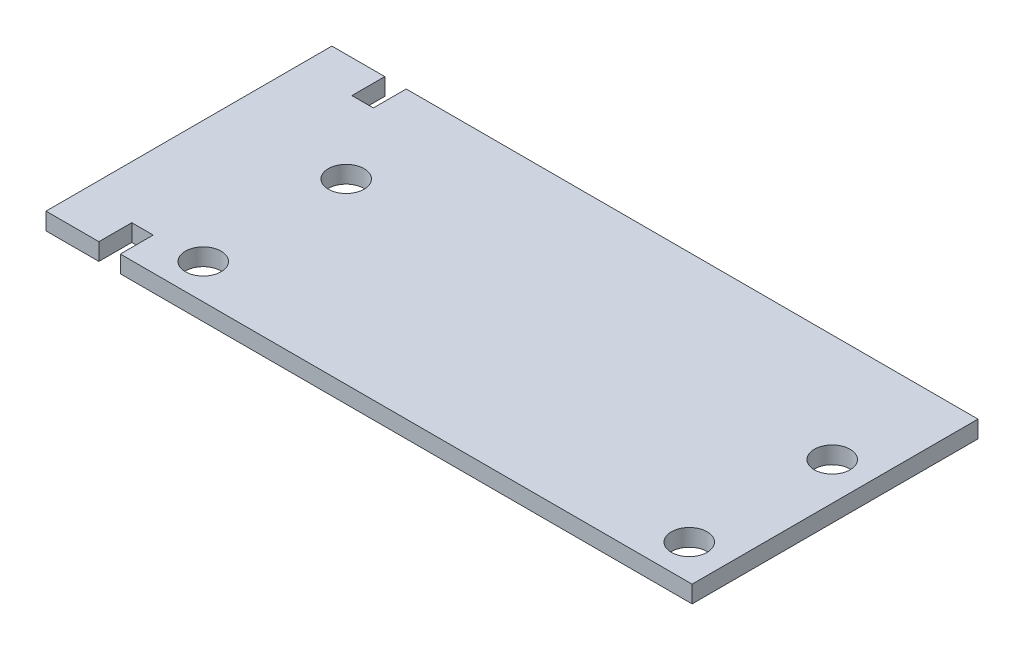
ISO-10303-21;
HEADER;
FILE_DESCRIPTION(('STEP AP214'),'2;1');
FILE_NAME('part.step','',(''),(''),'','','');
FILE_SCHEMA(('AUTOMOTIVE_DESIGN { 1 0 10303 214 1 1 1 1 }'));
ENDSEC;
DATA;
#1=APPLICATION_CONTEXT('core data for automotive mechanical design processes');
#2=APPLICATION_PROTOCOL_DEFINITION('international standard','automotive_design',2000,#1);
#3=PRODUCT_CONTEXT('',#1,'mechanical');
#4=PRODUCT('Part','Part','',(#3));
#5=PRODUCT_RELATED_PRODUCT_CATEGORY('part','',(#4));
#6=PRODUCT_DEFINITION_FORMATION('','',#4);
#7=PRODUCT_DEFINITION_CONTEXT('part definition',#1,'design');
#8=PRODUCT_DEFINITION('design','',#6,#7);
#9=PRODUCT_DEFINITION_SHAPE('','',#8);
#10=(LENGTH_UNIT() NAMED_UNIT(*) SI_UNIT(.MILLI.,.METRE.));
#11=(NAMED_UNIT(*) PLANE_ANGLE_UNIT() SI_UNIT($,.RADIAN.));
#12=(NAMED_UNIT(*) SI_UNIT($,.STERADIAN.) SOLID_ANGLE_UNIT());
#13=UNCERTAINTY_MEASURE_WITH_UNIT(LENGTH_MEASURE(1.E-05),#10,'distance_accuracy_value','');
#14=(GEOMETRIC_REPRESENTATION_CONTEXT(3) GLOBAL_UNCERTAINTY_ASSIGNED_CONTEXT((#13)) GLOBAL_UNIT_ASSIGNED_CONTEXT((#10,
#11,#12)) REPRESENTATION_CONTEXT('',''));
#15=CARTESIAN_POINT('',(0.,0.,0.));
#16=DIRECTION('',(0.,0.,1.));
#17=DIRECTION('',(1.,0.,0.));
#18=AXIS2_PLACEMENT_3D('',#15,#16,#17);
#19=CARTESIAN_POINT('',(0.,1.2,0.));
#20=DIRECTION('',(1.,0.,0.));
#21=DIRECTION('',(0.,0.,-1.));
#22=AXIS2_PLACEMENT_3D('',#19,#20,#21);
#23=PLANE('',#22);
#24=DIRECTION('',(0.,0.,1.));
#25=VECTOR('',#24,1.);
#26=CARTESIAN_POINT('',(0.,0.,0.));
#27=LINE('',#26,#25);
#28=CARTESIAN_POINT('',(0.,0.,-2.3));
#29=VERTEX_POINT('',#28);
#30=CARTESIAN_POINT('',(0.,0.,0.));
#31=VERTEX_POINT('',#30);
#32=EDGE_CURVE('E158',#29,#31,#27,.T.);
#33=ORIENTED_EDGE('',*,*,#32,.T.);
#34=DIRECTION('',(0.,-1.,0.));
#35=VECTOR('',#34,1.);
#36=CARTESIAN_POINT('',(0.,1.2,0.));
#37=LINE('',#36,#35);
#38=CARTESIAN_POINT('',(0.,1.2,0.));
#39=VERTEX_POINT('',#38);
#40=EDGE_CURVE('E11',#39,#31,#37,.T.);
#41=ORIENTED_EDGE('',*,*,#40,.F.);
#42=DIRECTION('',(0.,0.,1.));
#43=VECTOR('',#42,1.);
#44=CARTESIAN_POINT('',(0.,1.2,0.));
#45=LINE('',#44,#43);
#46=CARTESIAN_POINT('',(0.,1.2,-2.3));
#47=VERTEX_POINT('',#46);
#48=EDGE_CURVE('E181',#47,#39,#45,.T.);
#49=ORIENTED_EDGE('',*,*,#48,.F.);
#50=DIRECTION('',(0.,-1.,0.));
#51=VECTOR('',#50,1.);
#52=CARTESIAN_POINT('',(0.,1.2,-2.3));
#53=LINE('',#52,#51);
#54=EDGE_CURVE('E154',#47,#29,#53,.T.);
#55=ORIENTED_EDGE('',*,*,#54,.T.);
#56=EDGE_LOOP('',(#33,#41,#49,#55));
#57=FACE_BOUND('',#56,.T.);
#58=ADVANCED_FACE('F38',(#57),#23,.F.);
#59=CARTESIAN_POINT('',(0.,1.2,0.));
#60=DIRECTION('',(0.,0.,-1.));
#61=DIRECTION('',(-1.,0.,0.));
#62=AXIS2_PLACEMENT_3D('',#59,#60,#61);
#63=PLANE('',#62);
#64=DIRECTION('',(1.,0.,0.));
#65=VECTOR('',#64,1.);
#66=CARTESIAN_POINT('',(0.,0.,0.));
#67=LINE('',#66,#65);
#68=CARTESIAN_POINT('',(40.,0.,0.));
#69=VERTEX_POINT('',#68);
#70=EDGE_CURVE('E161',#31,#69,#67,.T.);
#71=ORIENTED_EDGE('',*,*,#70,.T.);
#72=DIRECTION('',(0.,-1.,0.));
#73=VECTOR('',#72,1.);
#74=CARTESIAN_POINT('',(40.,1.2,0.));
#75=LINE('',#74,#73);
#76=CARTESIAN_POINT('',(40.,1.2,0.));
#77=VERTEX_POINT('',#76);
#78=EDGE_CURVE('E46',#77,#69,#75,.T.);
#79=ORIENTED_EDGE('',*,*,#78,.F.);
#80=DIRECTION('',(1.,0.,0.));
#81=VECTOR('',#80,1.);
#82=CARTESIAN_POINT('',(0.,1.2,0.));
#83=LINE('',#82,#81);
#84=EDGE_CURVE('E109',#39,#77,#83,.T.);
#85=ORIENTED_EDGE('',*,*,#84,.F.);
#86=ORIENTED_EDGE('',*,*,#40,.T.);
#87=EDGE_LOOP('',(#71,#79,#85,#86));
#88=FACE_BOUND('',#87,.T.);
#89=ADVANCED_FACE('F260',(#88),#63,.F.);
#90=CARTESIAN_POINT('',(40.,1.2,0.));
#91=DIRECTION('',(-1.,0.,0.));
#92=DIRECTION('',(0.,0.,1.));
#93=AXIS2_PLACEMENT_3D('',#90,#91,#92);
#94=PLANE('',#93);
#95=DIRECTION('',(0.,0.,-1.));
#96=VECTOR('',#95,1.);
#97=CARTESIAN_POINT('',(40.,0.,0.));
#98=LINE('',#97,#96);
#99=CARTESIAN_POINT('',(40.,0.,-20.));
#100=VERTEX_POINT('',#99);
#101=EDGE_CURVE('E164',#69,#100,#98,.T.);
#102=ORIENTED_EDGE('',*,*,#101,.T.);
#103=DIRECTION('',(0.,-1.,0.));
#104=VECTOR('',#103,1.);
#105=CARTESIAN_POINT('',(40.,1.2,-20.));
#106=LINE('',#105,#104);
#107=CARTESIAN_POINT('',(40.,1.2,-20.));
#108=VERTEX_POINT('',#107);
#109=EDGE_CURVE('E200',#108,#100,#106,.T.);
#110=ORIENTED_EDGE('',*,*,#109,.F.);
#111=DIRECTION('',(0.,0.,-1.));
#112=VECTOR('',#111,1.);
#113=CARTESIAN_POINT('',(40.,1.2,0.));
#114=LINE('',#113,#112);
#115=EDGE_CURVE('E208',#77,#108,#114,.T.);
#116=ORIENTED_EDGE('',*,*,#115,.F.);
#117=ORIENTED_EDGE('',*,*,#78,.T.);
#118=EDGE_LOOP('',(#102,#110,#116,#117));
#119=FACE_BOUND('',#118,.T.);
#120=ADVANCED_FACE('F206',(#119),#94,.F.);
#121=CARTESIAN_POINT('',(0.,1.2,-20.));
#122=DIRECTION('',(0.,0.,1.));
#123=DIRECTION('',(1.,0.,0.));
#124=AXIS2_PLACEMENT_3D('',#121,#122,#123);
#125=PLANE('',#124);
#126=DIRECTION('',(-1.,0.,0.));
#127=VECTOR('',#126,1.);
#128=CARTESIAN_POINT('',(0.,0.,-20.));
#129=LINE('',#128,#127);
#130=CARTESIAN_POINT('',(0.,0.,-20.));
#131=VERTEX_POINT('',#130);
#132=EDGE_CURVE('E166',#100,#131,#129,.T.);
#133=ORIENTED_EDGE('',*,*,#132,.T.);
#134=DIRECTION('',(0.,-1.,0.));
#135=VECTOR('',#134,1.);
#136=CARTESIAN_POINT('',(0.,1.2,-20.));
#137=LINE('',#136,#135);
#138=CARTESIAN_POINT('',(0.,1.2,-20.));
#139=VERTEX_POINT('',#138);
#140=EDGE_CURVE('E197',#139,#131,#137,.T.);
#141=ORIENTED_EDGE('',*,*,#140,.F.);
#142=DIRECTION('',(-1.,0.,0.));
#143=VECTOR('',#142,1.);
#144=CARTESIAN_POINT('',(0.,1.2,-20.));
#145=LINE('',#144,#143);
#146=EDGE_CURVE('E226',#108,#139,#145,.T.);
#147=ORIENTED_EDGE('',*,*,#146,.F.);
#148=ORIENTED_EDGE('',*,*,#109,.T.);
#149=EDGE_LOOP('',(#133,#141,#147,#148));
#150=FACE_BOUND('',#149,.T.);
#151=ADVANCED_FACE('F217',(#150),#125,.F.);
#152=CARTESIAN_POINT('',(0.,1.2,-17.7));
#153=DIRECTION('',(1.,0.,0.));
#154=DIRECTION('',(0.,0.,-1.));
#155=AXIS2_PLACEMENT_3D('',#152,#153,#154);
#156=PLANE('',#155);
#157=DIRECTION('',(0.,0.,1.));
#158=VECTOR('',#157,1.);
#159=CARTESIAN_POINT('',(0.,0.,-17.7));
#160=LINE('',#159,#158);
#161=CARTESIAN_POINT('',(0.,0.,-17.7));
#162=VERTEX_POINT('',#161);
#163=EDGE_CURVE('E168',#131,#162,#160,.T.);
#164=ORIENTED_EDGE('',*,*,#163,.T.);
#165=DIRECTION('',(0.,-1.,0.));
#166=VECTOR('',#165,1.);
#167=CARTESIAN_POINT('',(0.,1.2,-17.7));
#168=LINE('',#167,#166);
#169=CARTESIAN_POINT('',(0.,1.2,-17.7));
#170=VERTEX_POINT('',#169);
#171=EDGE_CURVE('E194',#170,#162,#168,.T.);
#172=ORIENTED_EDGE('',*,*,#171,.F.);
#173=DIRECTION('',(0.,0.,1.));
#174=VECTOR('',#173,1.);
#175=CARTESIAN_POINT('',(0.,1.2,-17.7));
#176=LINE('',#175,#174);
#177=EDGE_CURVE('E223',#139,#170,#176,.T.);
#178=ORIENTED_EDGE('',*,*,#177,.F.);
#179=ORIENTED_EDGE('',*,*,#140,.T.);
#180=EDGE_LOOP('',(#164,#172,#178,#179));
#181=FACE_BOUND('',#180,.T.);
#182=ADVANCED_FACE('F221',(#181),#156,.F.);
#183=CARTESIAN_POINT('',(0.,1.2,-17.7));
#184=DIRECTION('',(0.,0.,1.));
#185=DIRECTION('',(1.,0.,0.));
#186=AXIS2_PLACEMENT_3D('',#183,#184,#185);
#187=PLANE('',#186);
#188=DIRECTION('',(-1.,0.,0.));
#189=VECTOR('',#188,1.);
#190=CARTESIAN_POINT('',(0.,0.,-17.7));
#191=LINE('',#190,#189);
#192=CARTESIAN_POINT('',(-1.5,0.,-17.7));
#193=VERTEX_POINT('',#192);
#194=EDGE_CURVE('E170',#162,#193,#191,.T.);
#195=ORIENTED_EDGE('',*,*,#194,.T.);
#196=DIRECTION('',(0.,-1.,0.));
#197=VECTOR('',#196,1.);
#198=CARTESIAN_POINT('',(-1.5,1.2,-17.7));
#199=LINE('',#198,#197);
#200=CARTESIAN_POINT('',(-1.5,1.2,-17.7));
#201=VERTEX_POINT('',#200);
#202=EDGE_CURVE('E191',#201,#193,#199,.T.);
#203=ORIENTED_EDGE('',*,*,#202,.F.);
#204=DIRECTION('',(-1.,0.,0.));
#205=VECTOR('',#204,1.);
#206=CARTESIAN_POINT('',(0.,1.2,-17.7));
#207=LINE('',#206,#205);
#208=EDGE_CURVE('E225',#170,#201,#207,.T.);
#209=ORIENTED_EDGE('',*,*,#208,.F.);
#210=ORIENTED_EDGE('',*,*,#171,.T.);
#211=EDGE_LOOP('',(#195,#203,#209,#210));
#212=FACE_BOUND('',#211,.T.);
#213=ADVANCED_FACE('F273',(#212),#187,.F.);
#214=CARTESIAN_POINT('',(-1.5,1.2,-17.7));
#215=DIRECTION('',(-1.,0.,0.));
#216=DIRECTION('',(0.,0.,1.));
#217=AXIS2_PLACEMENT_3D('',#214,#215,#216);
#218=PLANE('',#217);
#219=DIRECTION('',(0.,0.,-1.));
#220=VECTOR('',#219,1.);
#221=CARTESIAN_POINT('',(-1.5,0.,-17.7));
#222=LINE('',#221,#220);
#223=CARTESIAN_POINT('',(-1.5,0.,-20.));
#224=VERTEX_POINT('',#223);
#225=EDGE_CURVE('E172',#193,#224,#222,.T.);
#226=ORIENTED_EDGE('',*,*,#225,.T.);
#227=DIRECTION('',(0.,-1.,0.));
#228=VECTOR('',#227,1.);
#229=CARTESIAN_POINT('',(-1.5,1.2,-20.));
#230=LINE('',#229,#228);
#231=CARTESIAN_POINT('',(-1.5,1.2,-20.));
#232=VERTEX_POINT('',#231);
#233=EDGE_CURVE('E188',#232,#224,#230,.T.);
#234=ORIENTED_EDGE('',*,*,#233,.F.);
#235=DIRECTION('',(0.,0.,-1.));
#236=VECTOR('',#235,1.);
#237=CARTESIAN_POINT('',(-1.5,1.2,-17.7));
#238=LINE('',#237,#236);
#239=EDGE_CURVE('E228',#201,#232,#238,.T.);
#240=ORIENTED_EDGE('',*,*,#239,.F.);
#241=ORIENTED_EDGE('',*,*,#202,.T.);
#242=EDGE_LOOP('',(#226,#234,#240,#241));
#243=FACE_BOUND('',#242,.T.);
#244=ADVANCED_FACE('F276',(#243),#218,.F.);
#245=CARTESIAN_POINT('',(-1.5,1.2,-20.));
#246=DIRECTION('',(0.,0.,1.));
#247=DIRECTION('',(1.,0.,0.));
#248=AXIS2_PLACEMENT_3D('',#245,#246,#247);
#249=PLANE('',#248);
#250=DIRECTION('',(-1.,0.,0.));
#251=VECTOR('',#250,1.);
#252=CARTESIAN_POINT('',(-1.5,0.,-20.));
#253=LINE('',#252,#251);
#254=CARTESIAN_POINT('',(-5.2,0.,-20.));
#255=VERTEX_POINT('',#254);
#256=EDGE_CURVE('E174',#224,#255,#253,.T.);
#257=ORIENTED_EDGE('',*,*,#256,.T.);
#258=DIRECTION('',(0.,-1.,0.));
#259=VECTOR('',#258,1.);
#260=CARTESIAN_POINT('',(-5.2,1.2,-20.));
#261=LINE('',#260,#259);
#262=CARTESIAN_POINT('',(-5.2,1.2,-20.));
#263=VERTEX_POINT('',#262);
#264=EDGE_CURVE('E185',#263,#255,#261,.T.);
#265=ORIENTED_EDGE('',*,*,#264,.F.);
#266=DIRECTION('',(-1.,0.,0.));
#267=VECTOR('',#266,1.);
#268=CARTESIAN_POINT('',(-1.5,1.2,-20.));
#269=LINE('',#268,#267);
#270=EDGE_CURVE('E234',#232,#263,#269,.T.);
#271=ORIENTED_EDGE('',*,*,#270,.F.);
#272=ORIENTED_EDGE('',*,*,#233,.T.);
#273=EDGE_LOOP('',(#257,#265,#271,#272));
#274=FACE_BOUND('',#273,.T.);
#275=ADVANCED_FACE('F240',(#274),#249,.F.);
#276=CARTESIAN_POINT('',(-5.2,1.2,-20.));
#277=DIRECTION('',(1.,0.,0.));
#278=DIRECTION('',(0.,0.,-1.));
#279=AXIS2_PLACEMENT_3D('',#276,#277,#278);
#280=PLANE('',#279);
#281=DIRECTION('',(0.,0.,1.));
#282=VECTOR('',#281,1.);
#283=CARTESIAN_POINT('',(-5.2,0.,-20.));
#284=LINE('',#283,#282);
#285=CARTESIAN_POINT('',(-5.2,0.,0.));
#286=VERTEX_POINT('',#285);
#287=EDGE_CURVE('E176',#255,#286,#284,.T.);
#288=ORIENTED_EDGE('',*,*,#287,.T.);
#289=DIRECTION('',(0.,-1.,0.));
#290=VECTOR('',#289,1.);
#291=CARTESIAN_POINT('',(-5.2,1.2,0.));
#292=LINE('',#291,#290);
#293=CARTESIAN_POINT('',(-5.2,1.2,0.));
#294=VERTEX_POINT('',#293);
#295=EDGE_CURVE('E149',#294,#286,#292,.T.);
#296=ORIENTED_EDGE('',*,*,#295,.F.);
#297=DIRECTION('',(0.,0.,1.));
#298=VECTOR('',#297,1.);
#299=CARTESIAN_POINT('',(-5.2,1.2,-20.));
#300=LINE('',#299,#298);
#301=EDGE_CURVE('E140',#263,#294,#300,.T.);
#302=ORIENTED_EDGE('',*,*,#301,.F.);
#303=ORIENTED_EDGE('',*,*,#264,.T.);
#304=EDGE_LOOP('',(#288,#296,#302,#303));
#305=FACE_BOUND('',#304,.T.);
#306=ADVANCED_FACE('F244',(#305),#280,.F.);
#307=CARTESIAN_POINT('',(-5.2,1.2,0.));
#308=DIRECTION('',(0.,0.,-1.));
#309=DIRECTION('',(-1.,0.,0.));
#310=AXIS2_PLACEMENT_3D('',#307,#308,#309);
#311=PLANE('',#310);
#312=DIRECTION('',(1.,0.,0.));
#313=VECTOR('',#312,1.);
#314=CARTESIAN_POINT('',(-5.2,0.,0.));
#315=LINE('',#314,#313);
#316=CARTESIAN_POINT('',(-1.5,0.,0.));
#317=VERTEX_POINT('',#316);
#318=EDGE_CURVE('E148',#286,#317,#315,.T.);
#319=ORIENTED_EDGE('',*,*,#318,.T.);
#320=DIRECTION('',(0.,-1.,0.));
#321=VECTOR('',#320,1.);
#322=CARTESIAN_POINT('',(-1.5,1.2,0.));
#323=LINE('',#322,#321);
#324=CARTESIAN_POINT('',(-1.5,1.2,0.));
#325=VERTEX_POINT('',#324);
#326=EDGE_CURVE('E145',#325,#317,#323,.T.);
#327=ORIENTED_EDGE('',*,*,#326,.F.);
#328=DIRECTION('',(1.,0.,0.));
#329=VECTOR('',#328,1.);
#330=CARTESIAN_POINT('',(-5.2,1.2,0.));
#331=LINE('',#330,#329);
#332=EDGE_CURVE('E134',#294,#325,#331,.T.);
#333=ORIENTED_EDGE('',*,*,#332,.F.);
#334=ORIENTED_EDGE('',*,*,#295,.T.);
#335=EDGE_LOOP('',(#319,#327,#333,#334));
#336=FACE_BOUND('',#335,.T.);
#337=ADVANCED_FACE('F146',(#336),#311,.F.);
#338=CARTESIAN_POINT('',(-1.5,1.2,0.));
#339=DIRECTION('',(-1.,0.,0.));
#340=DIRECTION('',(0.,0.,1.));
#341=AXIS2_PLACEMENT_3D('',#338,#339,#340);
#342=PLANE('',#341);
#343=DIRECTION('',(0.,0.,-1.));
#344=VECTOR('',#343,1.);
#345=CARTESIAN_POINT('',(-1.5,0.,0.));
#346=LINE('',#345,#344);
#347=CARTESIAN_POINT('',(-1.5,0.,-2.3));
#348=VERTEX_POINT('',#347);
#349=EDGE_CURVE('E95',#317,#348,#346,.T.);
#350=ORIENTED_EDGE('',*,*,#349,.T.);
#351=DIRECTION('',(0.,-1.,0.));
#352=VECTOR('',#351,1.);
#353=CARTESIAN_POINT('',(-1.5,1.2,-2.3));
#354=LINE('',#353,#352);
#355=CARTESIAN_POINT('',(-1.5,1.2,-2.3));
#356=VERTEX_POINT('',#355);
#357=EDGE_CURVE('E150',#356,#348,#354,.T.);
#358=ORIENTED_EDGE('',*,*,#357,.F.);
#359=DIRECTION('',(0.,0.,-1.));
#360=VECTOR('',#359,1.);
#361=CARTESIAN_POINT('',(-1.5,1.2,0.));
#362=LINE('',#361,#360);
#363=EDGE_CURVE('E138',#325,#356,#362,.T.);
#364=ORIENTED_EDGE('',*,*,#363,.F.);
#365=ORIENTED_EDGE('',*,*,#326,.T.);
#366=EDGE_LOOP('',(#350,#358,#364,#365));
#367=FACE_BOUND('',#366,.T.);
#368=ADVANCED_FACE('F152',(#367),#342,.F.);
#369=CARTESIAN_POINT('',(-1.5,1.2,-2.3));
#370=DIRECTION('',(0.,0.,-1.));
#371=DIRECTION('',(-1.,0.,0.));
#372=AXIS2_PLACEMENT_3D('',#369,#370,#371);
#373=PLANE('',#372);
#374=DIRECTION('',(1.,0.,0.));
#375=VECTOR('',#374,1.);
#376=CARTESIAN_POINT('',(-1.5,0.,-2.3));
#377=LINE('',#376,#375);
#378=EDGE_CURVE('E101',#348,#29,#377,.T.);
#379=ORIENTED_EDGE('',*,*,#378,.T.);
#380=ORIENTED_EDGE('',*,*,#54,.F.);
#381=DIRECTION('',(1.,0.,0.));
#382=VECTOR('',#381,1.);
#383=CARTESIAN_POINT('',(-1.5,1.2,-2.3));
#384=LINE('',#383,#382);
#385=EDGE_CURVE('E54',#356,#47,#384,.T.);
#386=ORIENTED_EDGE('',*,*,#385,.F.);
#387=ORIENTED_EDGE('',*,*,#357,.T.);
#388=EDGE_LOOP('',(#379,#380,#386,#387));
#389=FACE_BOUND('',#388,.T.);
#390=ADVANCED_FACE('F248',(#389),#373,.F.);
#391=CARTESIAN_POINT('',(0.,1.2,0.));
#392=DIRECTION('',(0.,-1.,0.));
#393=DIRECTION('',(0.,0.,-1.));
#394=AXIS2_PLACEMENT_3D('',#391,#392,#393);
#395=PLANE('',#394);
#396=CARTESIAN_POINT('',(3.35,1.2,-2.45));
#397=DIRECTION('',(0.,1.,0.));
#398=DIRECTION('',(0.,0.,1.));
#399=AXIS2_PLACEMENT_3D('',#396,#397,#398);
#400=CIRCLE('',#399,1.25);
#401=CARTESIAN_POINT('',(3.35,1.2,-1.2));
#402=VERTEX_POINT('',#401);
#403=EDGE_CURVE('E362',#402,#402,#400,.T.);
#404=ORIENTED_EDGE('',*,*,#403,.F.);
#405=EDGE_LOOP('',(#404));
#406=FACE_BOUND('',#405,.T.);
#407=CARTESIAN_POINT('',(3.35,1.2,-12.45));
#408=DIRECTION('',(0.,1.,0.));
#409=DIRECTION('',(0.,0.,1.));
#410=AXIS2_PLACEMENT_3D('',#407,#408,#409);
#411=CIRCLE('',#410,1.25);
#412=CARTESIAN_POINT('',(3.35,1.2,-11.2));
#413=VERTEX_POINT('',#412);
#414=EDGE_CURVE('E364',#413,#413,#411,.T.);
#415=ORIENTED_EDGE('',*,*,#414,.F.);
#416=EDGE_LOOP('',(#415));
#417=FACE_BOUND('',#416,.T.);
#418=CARTESIAN_POINT('',(37.35,1.2,-12.45));
#419=DIRECTION('',(0.,1.,0.));
#420=DIRECTION('',(0.,0.,1.));
#421=AXIS2_PLACEMENT_3D('',#418,#419,#420);
#422=CIRCLE('',#421,1.25000000000001);
#423=CARTESIAN_POINT('',(37.35,1.2,-11.2));
#424=VERTEX_POINT('',#423);
#425=EDGE_CURVE('E378',#424,#424,#422,.T.);
#426=ORIENTED_EDGE('',*,*,#425,.F.);
#427=EDGE_LOOP('',(#426));
#428=FACE_BOUND('',#427,.T.);
#429=CARTESIAN_POINT('',(37.35,1.2,-2.45));
#430=DIRECTION('',(0.,1.,0.));
#431=DIRECTION('',(0.,0.,1.));
#432=AXIS2_PLACEMENT_3D('',#429,#430,#431);
#433=CIRCLE('',#432,1.25);
#434=CARTESIAN_POINT('',(37.35,1.2,-1.2));
#435=VERTEX_POINT('',#434);
#436=EDGE_CURVE('E370',#435,#435,#433,.T.);
#437=ORIENTED_EDGE('',*,*,#436,.F.);
#438=EDGE_LOOP('',(#437));
#439=FACE_BOUND('',#438,.T.);
#440=ORIENTED_EDGE('',*,*,#48,.T.);
#441=ORIENTED_EDGE('',*,*,#84,.T.);
#442=ORIENTED_EDGE('',*,*,#115,.T.);
#443=ORIENTED_EDGE('',*,*,#146,.T.);
#444=ORIENTED_EDGE('',*,*,#177,.T.);
#445=ORIENTED_EDGE('',*,*,#208,.T.);
#446=ORIENTED_EDGE('',*,*,#239,.T.);
#447=ORIENTED_EDGE('',*,*,#270,.T.);
#448=ORIENTED_EDGE('',*,*,#301,.T.);
#449=ORIENTED_EDGE('',*,*,#332,.T.);
#450=ORIENTED_EDGE('',*,*,#363,.T.);
#451=ORIENTED_EDGE('',*,*,#385,.T.);
#452=EDGE_LOOP('',(#440,#441,#442,#443,#444,#445,#446,#447,#448,#449,#450,#451));
#453=FACE_BOUND('',#452,.T.);
#454=ADVANCED_FACE('F136',(#406,#417,#428,#439,#453),#395,.F.);
#455=CARTESIAN_POINT('',(0.,0.,0.));
#456=DIRECTION('',(0.,-1.,0.));
#457=DIRECTION('',(0.,0.,-1.));
#458=AXIS2_PLACEMENT_3D('',#455,#456,#457);
#459=PLANE('',#458);
#460=CARTESIAN_POINT('',(3.35,0.,-2.45));
#461=DIRECTION('',(0.,1.,0.));
#462=DIRECTION('',(0.,0.,1.));
#463=AXIS2_PLACEMENT_3D('',#460,#461,#462);
#464=CIRCLE('',#463,1.25);
#465=CARTESIAN_POINT('',(3.35,0.,-1.2));
#466=VERTEX_POINT('',#465);
#467=EDGE_CURVE('E359',#466,#466,#464,.T.);
#468=ORIENTED_EDGE('',*,*,#467,.T.);
#469=EDGE_LOOP('',(#468));
#470=FACE_BOUND('',#469,.T.);
#471=CARTESIAN_POINT('',(3.35,0.,-12.45));
#472=DIRECTION('',(0.,1.,0.));
#473=DIRECTION('',(0.,0.,1.));
#474=AXIS2_PLACEMENT_3D('',#471,#472,#473);
#475=CIRCLE('',#474,1.25);
#476=CARTESIAN_POINT('',(3.35,0.,-11.2));
#477=VERTEX_POINT('',#476);
#478=EDGE_CURVE('E383',#477,#477,#475,.T.);
#479=ORIENTED_EDGE('',*,*,#478,.T.);
#480=EDGE_LOOP('',(#479));
#481=FACE_BOUND('',#480,.T.);
#482=CARTESIAN_POINT('',(37.35,0.,-12.45));
#483=DIRECTION('',(0.,1.,0.));
#484=DIRECTION('',(0.,0.,1.));
#485=AXIS2_PLACEMENT_3D('',#482,#483,#484);
#486=CIRCLE('',#485,1.25000000000001);
#487=CARTESIAN_POINT('',(37.35,0.,-11.2));
#488=VERTEX_POINT('',#487);
#489=EDGE_CURVE('E373',#488,#488,#486,.T.);
#490=ORIENTED_EDGE('',*,*,#489,.T.);
#491=EDGE_LOOP('',(#490));
#492=FACE_BOUND('',#491,.T.);
#493=CARTESIAN_POINT('',(37.35,0.,-2.45));
#494=DIRECTION('',(0.,1.,0.));
#495=DIRECTION('',(0.,0.,1.));
#496=AXIS2_PLACEMENT_3D('',#493,#494,#495);
#497=CIRCLE('',#496,1.25);
#498=CARTESIAN_POINT('',(37.35,0.,-1.2));
#499=VERTEX_POINT('',#498);
#500=EDGE_CURVE('E162',#499,#499,#497,.T.);
#501=ORIENTED_EDGE('',*,*,#500,.T.);
#502=EDGE_LOOP('',(#501));
#503=FACE_BOUND('',#502,.T.);
#504=ORIENTED_EDGE('',*,*,#32,.F.);
#505=ORIENTED_EDGE('',*,*,#378,.F.);
#506=ORIENTED_EDGE('',*,*,#349,.F.);
#507=ORIENTED_EDGE('',*,*,#318,.F.);
#508=ORIENTED_EDGE('',*,*,#287,.F.);
#509=ORIENTED_EDGE('',*,*,#256,.F.);
#510=ORIENTED_EDGE('',*,*,#225,.F.);
#511=ORIENTED_EDGE('',*,*,#194,.F.);
#512=ORIENTED_EDGE('',*,*,#163,.F.);
#513=ORIENTED_EDGE('',*,*,#132,.F.);
#514=ORIENTED_EDGE('',*,*,#101,.F.);
#515=ORIENTED_EDGE('',*,*,#70,.F.);
#516=EDGE_LOOP('',(#504,#505,#506,#507,#508,#509,#510,#511,#512,#513,#514,#515));
#517=FACE_BOUND('',#516,.T.);
#518=ADVANCED_FACE('F212',(#470,#481,#492,#503,#517),#459,.T.);
#519=CARTESIAN_POINT('',(37.35,0.,-2.45));
#520=DIRECTION('',(0.,1.,0.));
#521=DIRECTION('',(0.,0.,1.));
#522=AXIS2_PLACEMENT_3D('',#519,#520,#521);
#523=CYLINDRICAL_SURFACE('',#522,1.25);
#524=ORIENTED_EDGE('',*,*,#500,.F.);
#525=EDGE_LOOP('',(#524));
#526=FACE_BOUND('',#525,.T.);
#527=ORIENTED_EDGE('',*,*,#436,.T.);
#528=EDGE_LOOP('',(#527));
#529=FACE_BOUND('',#528,.T.);
#530=ADVANCED_FACE('F313',(#526,#529),#523,.F.);
#531=CARTESIAN_POINT('',(37.35,0.,-12.45));
#532=DIRECTION('',(0.,1.,0.));
#533=DIRECTION('',(0.,0.,1.));
#534=AXIS2_PLACEMENT_3D('',#531,#532,#533);
#535=CYLINDRICAL_SURFACE('',#534,1.25000000000001);
#536=ORIENTED_EDGE('',*,*,#489,.F.);
#537=EDGE_LOOP('',(#536));
#538=FACE_BOUND('',#537,.T.);
#539=ORIENTED_EDGE('',*,*,#425,.T.);
#540=EDGE_LOOP('',(#539));
#541=FACE_BOUND('',#540,.T.);
#542=ADVANCED_FACE('F322',(#538,#541),#535,.F.);
#543=CARTESIAN_POINT('',(3.35,0.,-12.45));
#544=DIRECTION('',(0.,1.,0.));
#545=DIRECTION('',(0.,0.,1.));
#546=AXIS2_PLACEMENT_3D('',#543,#544,#545);
#547=CYLINDRICAL_SURFACE('',#546,1.25);
#548=ORIENTED_EDGE('',*,*,#478,.F.);
#549=EDGE_LOOP('',(#548));
#550=FACE_BOUND('',#549,.T.);
#551=ORIENTED_EDGE('',*,*,#414,.T.);
#552=EDGE_LOOP('',(#551));
#553=FACE_BOUND('',#552,.T.);
#554=ADVANCED_FACE('F332',(#550,#553),#547,.F.);
#555=CARTESIAN_POINT('',(3.35,0.,-2.45));
#556=DIRECTION('',(0.,1.,0.));
#557=DIRECTION('',(0.,0.,1.));
#558=AXIS2_PLACEMENT_3D('',#555,#556,#557);
#559=CYLINDRICAL_SURFACE('',#558,1.25);
#560=ORIENTED_EDGE('',*,*,#467,.F.);
#561=EDGE_LOOP('',(#560));
#562=FACE_BOUND('',#561,.T.);
#563=ORIENTED_EDGE('',*,*,#403,.T.);
#564=EDGE_LOOP('',(#563));
#565=FACE_BOUND('',#564,.T.);
#566=ADVANCED_FACE('F342',(#562,#565),#559,.F.);
#567=CLOSED_SHELL('',(#58,#89,#120,#151,#182,#213,#244,#275,#306,#337,#368,#390,#454,#518,#530,
#542,#554,#566));
#568=MANIFOLD_SOLID_BREP('B2',#567);
#569=ADVANCED_BREP_SHAPE_REPRESENTATION('',(#18,#568),#14);
#570=SHAPE_DEFINITION_REPRESENTATION(#9,#569);
ENDSEC;
END-ISO-10303-21;
